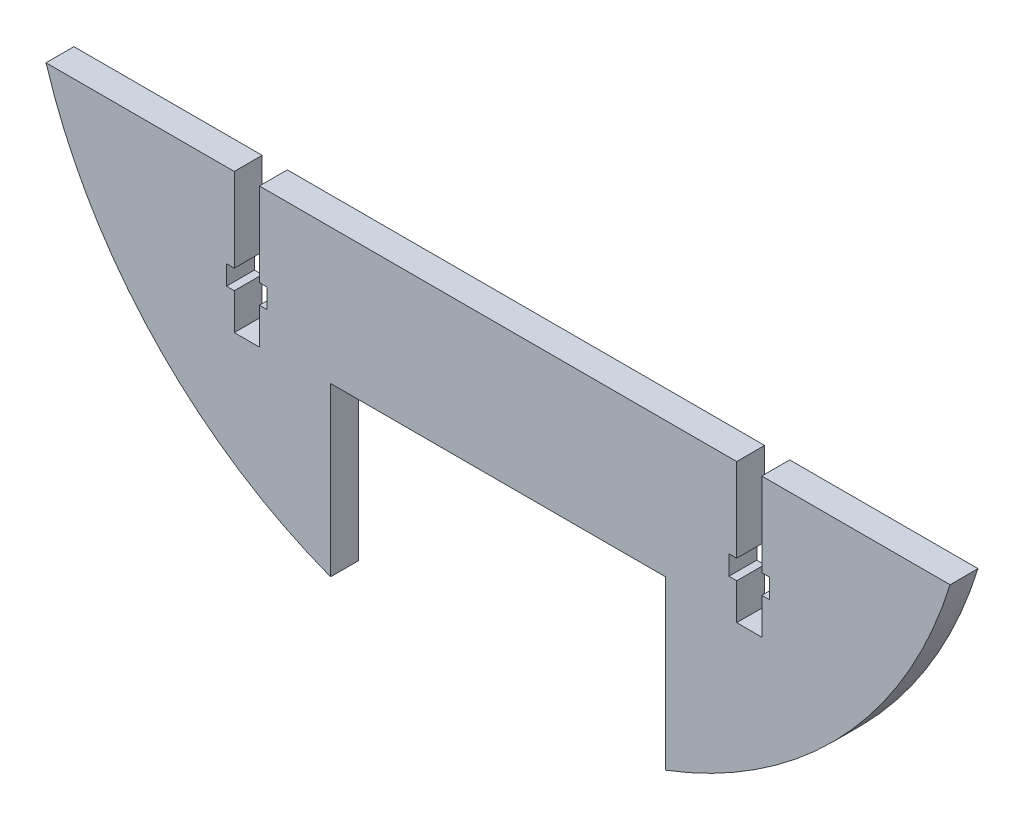
ISO-10303-21;
HEADER;
FILE_DESCRIPTION(('STEP AP214'),'2;1');
FILE_NAME('part.step','',(''),(''),'','','');
FILE_SCHEMA(('AUTOMOTIVE_DESIGN { 1 0 10303 214 1 1 1 1 }'));
ENDSEC;
DATA;
#1=APPLICATION_CONTEXT('core data for automotive mechanical design processes');
#2=APPLICATION_PROTOCOL_DEFINITION('international standard','automotive_design',2000,#1);
#3=PRODUCT_CONTEXT('',#1,'mechanical');
#4=PRODUCT('Part','Part','',(#3));
#5=PRODUCT_RELATED_PRODUCT_CATEGORY('part','',(#4));
#6=PRODUCT_DEFINITION_FORMATION('','',#4);
#7=PRODUCT_DEFINITION_CONTEXT('part definition',#1,'design');
#8=PRODUCT_DEFINITION('design','',#6,#7);
#9=PRODUCT_DEFINITION_SHAPE('','',#8);
#10=(LENGTH_UNIT() NAMED_UNIT(*) SI_UNIT(.MILLI.,.METRE.));
#11=(NAMED_UNIT(*) PLANE_ANGLE_UNIT() SI_UNIT($,.RADIAN.));
#12=(NAMED_UNIT(*) SI_UNIT($,.STERADIAN.) SOLID_ANGLE_UNIT());
#13=UNCERTAINTY_MEASURE_WITH_UNIT(LENGTH_MEASURE(1.E-05),#10,'distance_accuracy_value','');
#14=(GEOMETRIC_REPRESENTATION_CONTEXT(3) GLOBAL_UNCERTAINTY_ASSIGNED_CONTEXT((#13)) GLOBAL_UNIT_ASSIGNED_CONTEXT((#10,
#11,#12)) REPRESENTATION_CONTEXT('',''));
#15=CARTESIAN_POINT('',(0.,0.,0.));
#16=DIRECTION('',(0.,0.,1.));
#17=DIRECTION('',(1.,0.,0.));
#18=AXIS2_PLACEMENT_3D('',#15,#16,#17);
#19=CARTESIAN_POINT('',(0.,0.,5.));
#20=DIRECTION('',(0.,0.,-1.));
#21=DIRECTION('',(-1.,0.,0.));
#22=AXIS2_PLACEMENT_3D('',#19,#20,#21);
#23=CYLINDRICAL_SURFACE('',#22,84.75);
#24=CARTESIAN_POINT('',(0.,0.,0.));
#25=DIRECTION('',(0.,0.,1.));
#26=DIRECTION('',(1.,0.,0.));
#27=AXIS2_PLACEMENT_3D('',#24,#25,#26);
#28=CIRCLE('',#27,84.75);
#29=CARTESIAN_POINT('',(-80.9787780841376,-25.,0.));
#30=VERTEX_POINT('',#29);
#31=CARTESIAN_POINT('',(-30.,-79.2626172921384,0.));
#32=VERTEX_POINT('',#31);
#33=EDGE_CURVE('E262',#30,#32,#28,.T.);
#34=ORIENTED_EDGE('',*,*,#33,.T.);
#35=DIRECTION('',(0.,0.,-1.));
#36=VECTOR('',#35,1.);
#37=CARTESIAN_POINT('',(-30.,-79.2626172921384,5.));
#38=LINE('',#37,#36);
#39=CARTESIAN_POINT('',(-30.,-79.2626172921384,5.));
#40=VERTEX_POINT('',#39);
#41=EDGE_CURVE('E11',#40,#32,#38,.T.);
#42=ORIENTED_EDGE('',*,*,#41,.F.);
#43=CARTESIAN_POINT('',(0.,0.,5.));
#44=DIRECTION('',(0.,0.,1.));
#45=DIRECTION('',(1.,0.,0.));
#46=AXIS2_PLACEMENT_3D('',#43,#44,#45);
#47=CIRCLE('',#46,84.75);
#48=CARTESIAN_POINT('',(-80.9787780841376,-25.,5.));
#49=VERTEX_POINT('',#48);
#50=EDGE_CURVE('E320',#49,#40,#47,.T.);
#51=ORIENTED_EDGE('',*,*,#50,.F.);
#52=DIRECTION('',(0.,0.,-1.));
#53=VECTOR('',#52,1.);
#54=CARTESIAN_POINT('',(-80.9787780841376,-25.,5.));
#55=LINE('',#54,#53);
#56=EDGE_CURVE('E258',#49,#30,#55,.T.);
#57=ORIENTED_EDGE('',*,*,#56,.T.);
#58=EDGE_LOOP('',(#34,#42,#51,#57));
#59=FACE_BOUND('',#58,.T.);
#60=ADVANCED_FACE('F34',(#59),#23,.T.);
#61=CARTESIAN_POINT('',(-30.,-79.2626172921384,5.));
#62=DIRECTION('',(-1.,0.,0.));
#63=DIRECTION('',(0.,0.,1.));
#64=AXIS2_PLACEMENT_3D('',#61,#62,#63);
#65=PLANE('',#64);
#66=DIRECTION('',(0.,1.,0.));
#67=VECTOR('',#66,1.);
#68=CARTESIAN_POINT('',(-30.,-79.2626172921384,0.));
#69=LINE('',#68,#67);
#70=CARTESIAN_POINT('',(-30.,-49.2626172921384,0.));
#71=VERTEX_POINT('',#70);
#72=EDGE_CURVE('E265',#32,#71,#69,.T.);
#73=ORIENTED_EDGE('',*,*,#72,.T.);
#74=DIRECTION('',(0.,0.,-1.));
#75=VECTOR('',#74,1.);
#76=CARTESIAN_POINT('',(-30.,-49.2626172921384,5.));
#77=LINE('',#76,#75);
#78=CARTESIAN_POINT('',(-30.,-49.2626172921384,5.));
#79=VERTEX_POINT('',#78);
#80=EDGE_CURVE('E42',#79,#71,#77,.T.);
#81=ORIENTED_EDGE('',*,*,#80,.F.);
#82=DIRECTION('',(0.,1.,0.));
#83=VECTOR('',#82,1.);
#84=CARTESIAN_POINT('',(-30.,-79.2626172921384,5.));
#85=LINE('',#84,#83);
#86=EDGE_CURVE('E159',#40,#79,#85,.T.);
#87=ORIENTED_EDGE('',*,*,#86,.F.);
#88=ORIENTED_EDGE('',*,*,#41,.T.);
#89=EDGE_LOOP('',(#73,#81,#87,#88));
#90=FACE_BOUND('',#89,.T.);
#91=ADVANCED_FACE('F488',(#90),#65,.F.);
#92=CARTESIAN_POINT('',(-30.,-49.2626172921384,5.));
#93=DIRECTION('',(0.,1.,0.));
#94=DIRECTION('',(0.,0.,1.));
#95=AXIS2_PLACEMENT_3D('',#92,#93,#94);
#96=PLANE('',#95);
#97=DIRECTION('',(1.,0.,0.));
#98=VECTOR('',#97,1.);
#99=CARTESIAN_POINT('',(-30.,-49.2626172921384,0.));
#100=LINE('',#99,#98);
#101=CARTESIAN_POINT('',(30.,-49.2626172921384,0.));
#102=VERTEX_POINT('',#101);
#103=EDGE_CURVE('E267',#71,#102,#100,.T.);
#104=ORIENTED_EDGE('',*,*,#103,.T.);
#105=DIRECTION('',(0.,0.,-1.));
#106=VECTOR('',#105,1.);
#107=CARTESIAN_POINT('',(30.,-49.2626172921384,5.));
#108=LINE('',#107,#106);
#109=CARTESIAN_POINT('',(30.,-49.2626172921384,5.));
#110=VERTEX_POINT('',#109);
#111=EDGE_CURVE('E393',#110,#102,#108,.T.);
#112=ORIENTED_EDGE('',*,*,#111,.F.);
#113=DIRECTION('',(1.,0.,0.));
#114=VECTOR('',#113,1.);
#115=CARTESIAN_POINT('',(-30.,-49.2626172921384,5.));
#116=LINE('',#115,#114);
#117=EDGE_CURVE('E401',#79,#110,#116,.T.);
#118=ORIENTED_EDGE('',*,*,#117,.F.);
#119=ORIENTED_EDGE('',*,*,#80,.T.);
#120=EDGE_LOOP('',(#104,#112,#118,#119));
#121=FACE_BOUND('',#120,.T.);
#122=ADVANCED_FACE('F399',(#121),#96,.F.);
#123=CARTESIAN_POINT('',(30.,-79.2626172921384,5.));
#124=DIRECTION('',(1.,0.,0.));
#125=DIRECTION('',(0.,1.,0.));
#126=AXIS2_PLACEMENT_3D('',#123,#124,#125);
#127=PLANE('',#126);
#128=DIRECTION('',(0.,-1.,0.));
#129=VECTOR('',#128,1.);
#130=CARTESIAN_POINT('',(30.,-79.2626172921384,0.));
#131=LINE('',#130,#129);
#132=CARTESIAN_POINT('',(30.,-79.2626172921384,0.));
#133=VERTEX_POINT('',#132);
#134=EDGE_CURVE('E269',#102,#133,#131,.T.);
#135=ORIENTED_EDGE('',*,*,#134,.T.);
#136=DIRECTION('',(0.,0.,-1.));
#137=VECTOR('',#136,1.);
#138=CARTESIAN_POINT('',(30.,-79.2626172921384,5.));
#139=LINE('',#138,#137);
#140=CARTESIAN_POINT('',(30.,-79.2626172921384,5.));
#141=VERTEX_POINT('',#140);
#142=EDGE_CURVE('E390',#141,#133,#139,.T.);
#143=ORIENTED_EDGE('',*,*,#142,.F.);
#144=DIRECTION('',(0.,-1.,0.));
#145=VECTOR('',#144,1.);
#146=CARTESIAN_POINT('',(30.,-79.2626172921384,5.));
#147=LINE('',#146,#145);
#148=EDGE_CURVE('E419',#110,#141,#147,.T.);
#149=ORIENTED_EDGE('',*,*,#148,.F.);
#150=ORIENTED_EDGE('',*,*,#111,.T.);
#151=EDGE_LOOP('',(#135,#143,#149,#150));
#152=FACE_BOUND('',#151,.T.);
#153=ADVANCED_FACE('F410',(#152),#127,.F.);
#154=CARTESIAN_POINT('',(0.,0.,5.));
#155=DIRECTION('',(0.,0.,-1.));
#156=DIRECTION('',(-1.,0.,0.));
#157=AXIS2_PLACEMENT_3D('',#154,#155,#156);
#158=CYLINDRICAL_SURFACE('',#157,84.75);
#159=CARTESIAN_POINT('',(0.,0.,0.));
#160=DIRECTION('',(0.,0.,1.));
#161=DIRECTION('',(1.,0.,0.));
#162=AXIS2_PLACEMENT_3D('',#159,#160,#161);
#163=CIRCLE('',#162,84.75);
#164=CARTESIAN_POINT('',(80.9787780841376,-25.,0.));
#165=VERTEX_POINT('',#164);
#166=EDGE_CURVE('E271',#133,#165,#163,.T.);
#167=ORIENTED_EDGE('',*,*,#166,.T.);
#168=DIRECTION('',(0.,0.,-1.));
#169=VECTOR('',#168,1.);
#170=CARTESIAN_POINT('',(80.9787780841376,-25.,5.));
#171=LINE('',#170,#169);
#172=CARTESIAN_POINT('',(80.9787780841376,-25.,5.));
#173=VERTEX_POINT('',#172);
#174=EDGE_CURVE('E387',#173,#165,#171,.T.);
#175=ORIENTED_EDGE('',*,*,#174,.F.);
#176=CARTESIAN_POINT('',(0.,0.,5.));
#177=DIRECTION('',(0.,0.,1.));
#178=DIRECTION('',(1.,0.,0.));
#179=AXIS2_PLACEMENT_3D('',#176,#177,#178);
#180=CIRCLE('',#179,84.75);
#181=EDGE_CURVE('E416',#141,#173,#180,.T.);
#182=ORIENTED_EDGE('',*,*,#181,.F.);
#183=ORIENTED_EDGE('',*,*,#142,.T.);
#184=EDGE_LOOP('',(#167,#175,#182,#183));
#185=FACE_BOUND('',#184,.T.);
#186=ADVANCED_FACE('F414',(#185),#158,.T.);
#187=CARTESIAN_POINT('',(47.25,-25.,5.));
#188=DIRECTION('',(0.,-1.,0.));
#189=DIRECTION('',(1.,0.,0.));
#190=AXIS2_PLACEMENT_3D('',#187,#188,#189);
#191=PLANE('',#190);
#192=DIRECTION('',(-1.,0.,0.));
#193=VECTOR('',#192,1.);
#194=CARTESIAN_POINT('',(47.25,-25.,0.));
#195=LINE('',#194,#193);
#196=CARTESIAN_POINT('',(47.25,-25.,0.));
#197=VERTEX_POINT('',#196);
#198=EDGE_CURVE('E273',#165,#197,#195,.T.);
#199=ORIENTED_EDGE('',*,*,#198,.T.);
#200=DIRECTION('',(0.,0.,-1.));
#201=VECTOR('',#200,1.);
#202=CARTESIAN_POINT('',(47.25,-25.,5.));
#203=LINE('',#202,#201);
#204=CARTESIAN_POINT('',(47.25,-25.,5.));
#205=VERTEX_POINT('',#204);
#206=EDGE_CURVE('E384',#205,#197,#203,.T.);
#207=ORIENTED_EDGE('',*,*,#206,.F.);
#208=DIRECTION('',(-1.,0.,0.));
#209=VECTOR('',#208,1.);
#210=CARTESIAN_POINT('',(47.25,-25.,5.));
#211=LINE('',#210,#209);
#212=EDGE_CURVE('E418',#173,#205,#211,.T.);
#213=ORIENTED_EDGE('',*,*,#212,.F.);
#214=ORIENTED_EDGE('',*,*,#174,.T.);
#215=EDGE_LOOP('',(#199,#207,#213,#214));
#216=FACE_BOUND('',#215,.T.);
#217=ADVANCED_FACE('F501',(#216),#191,.F.);
#218=CARTESIAN_POINT('',(47.25,-25.,5.));
#219=DIRECTION('',(1.,0.,0.));
#220=DIRECTION('',(0.,1.,0.));
#221=AXIS2_PLACEMENT_3D('',#218,#219,#220);
#222=PLANE('',#221);
#223=DIRECTION('',(0.,-1.,0.));
#224=VECTOR('',#223,1.);
#225=CARTESIAN_POINT('',(47.25,-25.,0.));
#226=LINE('',#225,#224);
#227=CARTESIAN_POINT('',(47.25,-39.9999999999999,0.));
#228=VERTEX_POINT('',#227);
#229=EDGE_CURVE('E275',#197,#228,#226,.T.);
#230=ORIENTED_EDGE('',*,*,#229,.T.);
#231=DIRECTION('',(0.,0.,-1.));
#232=VECTOR('',#231,1.);
#233=CARTESIAN_POINT('',(47.25,-39.9999999999999,5.));
#234=LINE('',#233,#232);
#235=CARTESIAN_POINT('',(47.25,-39.9999999999999,5.));
#236=VERTEX_POINT('',#235);
#237=EDGE_CURVE('E381',#236,#228,#234,.T.);
#238=ORIENTED_EDGE('',*,*,#237,.F.);
#239=DIRECTION('',(0.,-1.,0.));
#240=VECTOR('',#239,1.);
#241=CARTESIAN_POINT('',(47.25,-25.,5.));
#242=LINE('',#241,#240);
#243=EDGE_CURVE('E421',#205,#236,#242,.T.);
#244=ORIENTED_EDGE('',*,*,#243,.F.);
#245=ORIENTED_EDGE('',*,*,#206,.T.);
#246=EDGE_LOOP('',(#230,#238,#244,#245));
#247=FACE_BOUND('',#246,.T.);
#248=ADVANCED_FACE('F504',(#247),#222,.F.);
#249=CARTESIAN_POINT('',(47.25,-39.9999999999999,5.));
#250=DIRECTION('',(0.,1.,0.));
#251=DIRECTION('',(0.,0.,1.));
#252=AXIS2_PLACEMENT_3D('',#249,#250,#251);
#253=PLANE('',#252);
#254=DIRECTION('',(1.,0.,0.));
#255=VECTOR('',#254,1.);
#256=CARTESIAN_POINT('',(47.25,-39.9999999999999,0.));
#257=LINE('',#256,#255);
#258=CARTESIAN_POINT('',(48.65,-39.9999999999999,0.));
#259=VERTEX_POINT('',#258);
#260=EDGE_CURVE('E277',#228,#259,#257,.T.);
#261=ORIENTED_EDGE('',*,*,#260,.T.);
#262=DIRECTION('',(0.,0.,-1.));
#263=VECTOR('',#262,1.);
#264=CARTESIAN_POINT('',(48.65,-39.9999999999999,5.));
#265=LINE('',#264,#263);
#266=CARTESIAN_POINT('',(48.65,-39.9999999999999,5.));
#267=VERTEX_POINT('',#266);
#268=EDGE_CURVE('E378',#267,#259,#265,.T.);
#269=ORIENTED_EDGE('',*,*,#268,.F.);
#270=DIRECTION('',(1.,0.,0.));
#271=VECTOR('',#270,1.);
#272=CARTESIAN_POINT('',(47.25,-39.9999999999999,5.));
#273=LINE('',#272,#271);
#274=EDGE_CURVE('E427',#236,#267,#273,.T.);
#275=ORIENTED_EDGE('',*,*,#274,.F.);
#276=ORIENTED_EDGE('',*,*,#237,.T.);
#277=EDGE_LOOP('',(#261,#269,#275,#276));
#278=FACE_BOUND('',#277,.T.);
#279=ADVANCED_FACE('F508',(#278),#253,.F.);
#280=CARTESIAN_POINT('',(48.65,-39.9999999999999,5.));
#281=DIRECTION('',(1.,0.,0.));
#282=DIRECTION('',(0.,1.,0.));
#283=AXIS2_PLACEMENT_3D('',#280,#281,#282);
#284=PLANE('',#283);
#285=DIRECTION('',(0.,-1.,0.));
#286=VECTOR('',#285,1.);
#287=CARTESIAN_POINT('',(48.65,-39.9999999999999,0.));
#288=LINE('',#287,#286);
#289=CARTESIAN_POINT('',(48.65,-43.4999999999999,0.));
#290=VERTEX_POINT('',#289);
#291=EDGE_CURVE('E279',#259,#290,#288,.T.);
#292=ORIENTED_EDGE('',*,*,#291,.T.);
#293=DIRECTION('',(0.,0.,-1.));
#294=VECTOR('',#293,1.);
#295=CARTESIAN_POINT('',(48.65,-43.4999999999999,5.));
#296=LINE('',#295,#294);
#297=CARTESIAN_POINT('',(48.65,-43.4999999999999,5.));
#298=VERTEX_POINT('',#297);
#299=EDGE_CURVE('E375',#298,#290,#296,.T.);
#300=ORIENTED_EDGE('',*,*,#299,.F.);
#301=DIRECTION('',(0.,-1.,0.));
#302=VECTOR('',#301,1.);
#303=CARTESIAN_POINT('',(48.65,-39.9999999999999,5.));
#304=LINE('',#303,#302);
#305=EDGE_CURVE('E429',#267,#298,#304,.T.);
#306=ORIENTED_EDGE('',*,*,#305,.F.);
#307=ORIENTED_EDGE('',*,*,#268,.T.);
#308=EDGE_LOOP('',(#292,#300,#306,#307));
#309=FACE_BOUND('',#308,.T.);
#310=ADVANCED_FACE('F512',(#309),#284,.F.);
#311=CARTESIAN_POINT('',(48.65,-43.4999999999999,5.));
#312=DIRECTION('',(0.,-1.,0.));
#313=DIRECTION('',(0.,0.,-1.));
#314=AXIS2_PLACEMENT_3D('',#311,#312,#313);
#315=PLANE('',#314);
#316=DIRECTION('',(-1.,0.,0.));
#317=VECTOR('',#316,1.);
#318=CARTESIAN_POINT('',(48.65,-43.4999999999999,0.));
#319=LINE('',#318,#317);
#320=CARTESIAN_POINT('',(47.25,-43.4999999999999,0.));
#321=VERTEX_POINT('',#320);
#322=EDGE_CURVE('E281',#290,#321,#319,.T.);
#323=ORIENTED_EDGE('',*,*,#322,.T.);
#324=DIRECTION('',(0.,0.,-1.));
#325=VECTOR('',#324,1.);
#326=CARTESIAN_POINT('',(47.25,-43.4999999999999,5.));
#327=LINE('',#326,#325);
#328=CARTESIAN_POINT('',(47.25,-43.4999999999999,5.));
#329=VERTEX_POINT('',#328);
#330=EDGE_CURVE('E372',#329,#321,#327,.T.);
#331=ORIENTED_EDGE('',*,*,#330,.F.);
#332=DIRECTION('',(-1.,0.,0.));
#333=VECTOR('',#332,1.);
#334=CARTESIAN_POINT('',(48.65,-43.4999999999999,5.));
#335=LINE('',#334,#333);
#336=EDGE_CURVE('E431',#298,#329,#335,.T.);
#337=ORIENTED_EDGE('',*,*,#336,.F.);
#338=ORIENTED_EDGE('',*,*,#299,.T.);
#339=EDGE_LOOP('',(#323,#331,#337,#338));
#340=FACE_BOUND('',#339,.T.);
#341=ADVANCED_FACE('F516',(#340),#315,.F.);
#342=CARTESIAN_POINT('',(47.25,-43.4999999999999,5.));
#343=DIRECTION('',(1.,0.,0.));
#344=DIRECTION('',(0.,1.,0.));
#345=AXIS2_PLACEMENT_3D('',#342,#343,#344);
#346=PLANE('',#345);
#347=DIRECTION('',(0.,-1.,0.));
#348=VECTOR('',#347,1.);
#349=CARTESIAN_POINT('',(47.25,-43.4999999999999,0.));
#350=LINE('',#349,#348);
#351=CARTESIAN_POINT('',(47.25,-49.9999999999999,0.));
#352=VERTEX_POINT('',#351);
#353=EDGE_CURVE('E283',#321,#352,#350,.T.);
#354=ORIENTED_EDGE('',*,*,#353,.T.);
#355=DIRECTION('',(0.,0.,-1.));
#356=VECTOR('',#355,1.);
#357=CARTESIAN_POINT('',(47.25,-49.9999999999999,5.));
#358=LINE('',#357,#356);
#359=CARTESIAN_POINT('',(47.25,-49.9999999999999,5.));
#360=VERTEX_POINT('',#359);
#361=EDGE_CURVE('E369',#360,#352,#358,.T.);
#362=ORIENTED_EDGE('',*,*,#361,.F.);
#363=DIRECTION('',(0.,-1.,0.));
#364=VECTOR('',#363,1.);
#365=CARTESIAN_POINT('',(47.25,-43.4999999999999,5.));
#366=LINE('',#365,#364);
#367=EDGE_CURVE('E433',#329,#360,#366,.T.);
#368=ORIENTED_EDGE('',*,*,#367,.F.);
#369=ORIENTED_EDGE('',*,*,#330,.T.);
#370=EDGE_LOOP('',(#354,#362,#368,#369));
#371=FACE_BOUND('',#370,.T.);
#372=ADVANCED_FACE('F520',(#371),#346,.F.);
#373=CARTESIAN_POINT('',(42.75,-49.9999999999999,5.));
#374=DIRECTION('',(0.,-1.,0.));
#375=DIRECTION('',(0.,0.,-1.));
#376=AXIS2_PLACEMENT_3D('',#373,#374,#375);
#377=PLANE('',#376);
#378=DIRECTION('',(-1.,0.,0.));
#379=VECTOR('',#378,1.);
#380=CARTESIAN_POINT('',(42.75,-49.9999999999999,0.));
#381=LINE('',#380,#379);
#382=CARTESIAN_POINT('',(42.75,-49.9999999999999,0.));
#383=VERTEX_POINT('',#382);
#384=EDGE_CURVE('E285',#352,#383,#381,.T.);
#385=ORIENTED_EDGE('',*,*,#384,.T.);
#386=DIRECTION('',(0.,0.,-1.));
#387=VECTOR('',#386,1.);
#388=CARTESIAN_POINT('',(42.75,-49.9999999999999,5.));
#389=LINE('',#388,#387);
#390=CARTESIAN_POINT('',(42.75,-49.9999999999999,5.));
#391=VERTEX_POINT('',#390);
#392=EDGE_CURVE('E366',#391,#383,#389,.T.);
#393=ORIENTED_EDGE('',*,*,#392,.F.);
#394=DIRECTION('',(-1.,0.,0.));
#395=VECTOR('',#394,1.);
#396=CARTESIAN_POINT('',(42.75,-49.9999999999999,5.));
#397=LINE('',#396,#395);
#398=EDGE_CURVE('E435',#360,#391,#397,.T.);
#399=ORIENTED_EDGE('',*,*,#398,.F.);
#400=ORIENTED_EDGE('',*,*,#361,.T.);
#401=EDGE_LOOP('',(#385,#393,#399,#400));
#402=FACE_BOUND('',#401,.T.);
#403=ADVANCED_FACE('F524',(#402),#377,.F.);
#404=CARTESIAN_POINT('',(42.75,-43.4999999999999,5.));
#405=DIRECTION('',(-1.,0.,0.));
#406=DIRECTION('',(0.,-1.,0.));
#407=AXIS2_PLACEMENT_3D('',#404,#405,#406);
#408=PLANE('',#407);
#409=DIRECTION('',(0.,1.,0.));
#410=VECTOR('',#409,1.);
#411=CARTESIAN_POINT('',(42.75,-43.4999999999999,0.));
#412=LINE('',#411,#410);
#413=CARTESIAN_POINT('',(42.75,-43.4999999999999,0.));
#414=VERTEX_POINT('',#413);
#415=EDGE_CURVE('E287',#383,#414,#412,.T.);
#416=ORIENTED_EDGE('',*,*,#415,.T.);
#417=DIRECTION('',(0.,0.,-1.));
#418=VECTOR('',#417,1.);
#419=CARTESIAN_POINT('',(42.75,-43.4999999999999,5.));
#420=LINE('',#419,#418);
#421=CARTESIAN_POINT('',(42.75,-43.4999999999999,5.));
#422=VERTEX_POINT('',#421);
#423=EDGE_CURVE('E363',#422,#414,#420,.T.);
#424=ORIENTED_EDGE('',*,*,#423,.F.);
#425=DIRECTION('',(0.,1.,0.));
#426=VECTOR('',#425,1.);
#427=CARTESIAN_POINT('',(42.75,-43.4999999999999,5.));
#428=LINE('',#427,#426);
#429=EDGE_CURVE('E437',#391,#422,#428,.T.);
#430=ORIENTED_EDGE('',*,*,#429,.F.);
#431=ORIENTED_EDGE('',*,*,#392,.T.);
#432=EDGE_LOOP('',(#416,#424,#430,#431));
#433=FACE_BOUND('',#432,.T.);
#434=ADVANCED_FACE('F528',(#433),#408,.F.);
#435=CARTESIAN_POINT('',(41.35,-43.4999999999999,5.));
#436=DIRECTION('',(0.,-1.,0.));
#437=DIRECTION('',(0.,0.,-1.));
#438=AXIS2_PLACEMENT_3D('',#435,#436,#437);
#439=PLANE('',#438);
#440=DIRECTION('',(-1.,0.,0.));
#441=VECTOR('',#440,1.);
#442=CARTESIAN_POINT('',(41.35,-43.4999999999999,0.));
#443=LINE('',#442,#441);
#444=CARTESIAN_POINT('',(41.35,-43.4999999999999,0.));
#445=VERTEX_POINT('',#444);
#446=EDGE_CURVE('E289',#414,#445,#443,.T.);
#447=ORIENTED_EDGE('',*,*,#446,.T.);
#448=DIRECTION('',(0.,0.,-1.));
#449=VECTOR('',#448,1.);
#450=CARTESIAN_POINT('',(41.35,-43.4999999999999,5.));
#451=LINE('',#450,#449);
#452=CARTESIAN_POINT('',(41.35,-43.4999999999999,5.));
#453=VERTEX_POINT('',#452);
#454=EDGE_CURVE('E360',#453,#445,#451,.T.);
#455=ORIENTED_EDGE('',*,*,#454,.F.);
#456=DIRECTION('',(-1.,0.,0.));
#457=VECTOR('',#456,1.);
#458=CARTESIAN_POINT('',(41.35,-43.4999999999999,5.));
#459=LINE('',#458,#457);
#460=EDGE_CURVE('E439',#422,#453,#459,.T.);
#461=ORIENTED_EDGE('',*,*,#460,.F.);
#462=ORIENTED_EDGE('',*,*,#423,.T.);
#463=EDGE_LOOP('',(#447,#455,#461,#462));
#464=FACE_BOUND('',#463,.T.);
#465=ADVANCED_FACE('F532',(#464),#439,.F.);
#466=CARTESIAN_POINT('',(41.35,-39.9999999999999,5.));
#467=DIRECTION('',(-1.,0.,0.));
#468=DIRECTION('',(0.,-1.,0.));
#469=AXIS2_PLACEMENT_3D('',#466,#467,#468);
#470=PLANE('',#469);
#471=DIRECTION('',(0.,1.,0.));
#472=VECTOR('',#471,1.);
#473=CARTESIAN_POINT('',(41.35,-39.9999999999999,0.));
#474=LINE('',#473,#472);
#475=CARTESIAN_POINT('',(41.35,-39.9999999999999,0.));
#476=VERTEX_POINT('',#475);
#477=EDGE_CURVE('E291',#445,#476,#474,.T.);
#478=ORIENTED_EDGE('',*,*,#477,.T.);
#479=DIRECTION('',(0.,0.,-1.));
#480=VECTOR('',#479,1.);
#481=CARTESIAN_POINT('',(41.35,-39.9999999999999,5.));
#482=LINE('',#481,#480);
#483=CARTESIAN_POINT('',(41.35,-39.9999999999999,5.));
#484=VERTEX_POINT('',#483);
#485=EDGE_CURVE('E357',#484,#476,#482,.T.);
#486=ORIENTED_EDGE('',*,*,#485,.F.);
#487=DIRECTION('',(0.,1.,0.));
#488=VECTOR('',#487,1.);
#489=CARTESIAN_POINT('',(41.35,-39.9999999999999,5.));
#490=LINE('',#489,#488);
#491=EDGE_CURVE('E441',#453,#484,#490,.T.);
#492=ORIENTED_EDGE('',*,*,#491,.F.);
#493=ORIENTED_EDGE('',*,*,#454,.T.);
#494=EDGE_LOOP('',(#478,#486,#492,#493));
#495=FACE_BOUND('',#494,.T.);
#496=ADVANCED_FACE('F536',(#495),#470,.F.);
#497=CARTESIAN_POINT('',(42.75,-39.9999999999999,5.));
#498=DIRECTION('',(0.,1.,0.));
#499=DIRECTION('',(0.,0.,1.));
#500=AXIS2_PLACEMENT_3D('',#497,#498,#499);
#501=PLANE('',#500);
#502=DIRECTION('',(1.,0.,0.));
#503=VECTOR('',#502,1.);
#504=CARTESIAN_POINT('',(42.75,-39.9999999999999,0.));
#505=LINE('',#504,#503);
#506=CARTESIAN_POINT('',(42.75,-39.9999999999999,0.));
#507=VERTEX_POINT('',#506);
#508=EDGE_CURVE('E293',#476,#507,#505,.T.);
#509=ORIENTED_EDGE('',*,*,#508,.T.);
#510=DIRECTION('',(0.,0.,-1.));
#511=VECTOR('',#510,1.);
#512=CARTESIAN_POINT('',(42.75,-39.9999999999999,5.));
#513=LINE('',#512,#511);
#514=CARTESIAN_POINT('',(42.75,-39.9999999999999,5.));
#515=VERTEX_POINT('',#514);
#516=EDGE_CURVE('E354',#515,#507,#513,.T.);
#517=ORIENTED_EDGE('',*,*,#516,.F.);
#518=DIRECTION('',(1.,0.,0.));
#519=VECTOR('',#518,1.);
#520=CARTESIAN_POINT('',(42.75,-39.9999999999999,5.));
#521=LINE('',#520,#519);
#522=EDGE_CURVE('E443',#484,#515,#521,.T.);
#523=ORIENTED_EDGE('',*,*,#522,.F.);
#524=ORIENTED_EDGE('',*,*,#485,.T.);
#525=EDGE_LOOP('',(#509,#517,#523,#524));
#526=FACE_BOUND('',#525,.T.);
#527=ADVANCED_FACE('F540',(#526),#501,.F.);
#528=CARTESIAN_POINT('',(42.75,-25.,5.));
#529=DIRECTION('',(-1.,0.,0.));
#530=DIRECTION('',(0.,-1.,0.));
#531=AXIS2_PLACEMENT_3D('',#528,#529,#530);
#532=PLANE('',#531);
#533=DIRECTION('',(0.,1.,0.));
#534=VECTOR('',#533,1.);
#535=CARTESIAN_POINT('',(42.75,-25.,0.));
#536=LINE('',#535,#534);
#537=CARTESIAN_POINT('',(42.75,-25.,0.));
#538=VERTEX_POINT('',#537);
#539=EDGE_CURVE('E295',#507,#538,#536,.T.);
#540=ORIENTED_EDGE('',*,*,#539,.T.);
#541=DIRECTION('',(0.,0.,-1.));
#542=VECTOR('',#541,1.);
#543=CARTESIAN_POINT('',(42.75,-25.,5.));
#544=LINE('',#543,#542);
#545=CARTESIAN_POINT('',(42.75,-25.,5.));
#546=VERTEX_POINT('',#545);
#547=EDGE_CURVE('E351',#546,#538,#544,.T.);
#548=ORIENTED_EDGE('',*,*,#547,.F.);
#549=DIRECTION('',(0.,1.,0.));
#550=VECTOR('',#549,1.);
#551=CARTESIAN_POINT('',(42.75,-25.,5.));
#552=LINE('',#551,#550);
#553=EDGE_CURVE('E445',#515,#546,#552,.T.);
#554=ORIENTED_EDGE('',*,*,#553,.F.);
#555=ORIENTED_EDGE('',*,*,#516,.T.);
#556=EDGE_LOOP('',(#540,#548,#554,#555));
#557=FACE_BOUND('',#556,.T.);
#558=ADVANCED_FACE('F544',(#557),#532,.F.);
#559=CARTESIAN_POINT('',(-42.75,-25.,5.));
#560=DIRECTION('',(0.,-1.,0.));
#561=DIRECTION('',(1.,0.,0.));
#562=AXIS2_PLACEMENT_3D('',#559,#560,#561);
#563=PLANE('',#562);
#564=DIRECTION('',(-1.,0.,0.));
#565=VECTOR('',#564,1.);
#566=CARTESIAN_POINT('',(-42.75,-25.,0.));
#567=LINE('',#566,#565);
#568=CARTESIAN_POINT('',(-42.75,-25.,0.));
#569=VERTEX_POINT('',#568);
#570=EDGE_CURVE('E297',#538,#569,#567,.T.);
#571=ORIENTED_EDGE('',*,*,#570,.T.);
#572=DIRECTION('',(0.,0.,-1.));
#573=VECTOR('',#572,1.);
#574=CARTESIAN_POINT('',(-42.75,-25.,5.));
#575=LINE('',#574,#573);
#576=CARTESIAN_POINT('',(-42.75,-25.,5.));
#577=VERTEX_POINT('',#576);
#578=EDGE_CURVE('E348',#577,#569,#575,.T.);
#579=ORIENTED_EDGE('',*,*,#578,.F.);
#580=DIRECTION('',(-1.,0.,0.));
#581=VECTOR('',#580,1.);
#582=CARTESIAN_POINT('',(-42.75,-25.,5.));
#583=LINE('',#582,#581);
#584=EDGE_CURVE('E447',#546,#577,#583,.T.);
#585=ORIENTED_EDGE('',*,*,#584,.F.);
#586=ORIENTED_EDGE('',*,*,#547,.T.);
#587=EDGE_LOOP('',(#571,#579,#585,#586));
#588=FACE_BOUND('',#587,.T.);
#589=ADVANCED_FACE('F548',(#588),#563,.F.);
#590=CARTESIAN_POINT('',(-42.75,-25.,5.));
#591=DIRECTION('',(1.,0.,0.));
#592=DIRECTION('',(0.,0.,-1.));
#593=AXIS2_PLACEMENT_3D('',#590,#591,#592);
#594=PLANE('',#593);
#595=DIRECTION('',(0.,-1.,0.));
#596=VECTOR('',#595,1.);
#597=CARTESIAN_POINT('',(-42.75,-25.,0.));
#598=LINE('',#597,#596);
#599=CARTESIAN_POINT('',(-42.75,-40.,0.));
#600=VERTEX_POINT('',#599);
#601=EDGE_CURVE('E299',#569,#600,#598,.T.);
#602=ORIENTED_EDGE('',*,*,#601,.T.);
#603=DIRECTION('',(0.,0.,-1.));
#604=VECTOR('',#603,1.);
#605=CARTESIAN_POINT('',(-42.75,-40.,5.));
#606=LINE('',#605,#604);
#607=CARTESIAN_POINT('',(-42.75,-40.,5.));
#608=VERTEX_POINT('',#607);
#609=EDGE_CURVE('E345',#608,#600,#606,.T.);
#610=ORIENTED_EDGE('',*,*,#609,.F.);
#611=DIRECTION('',(0.,-1.,0.));
#612=VECTOR('',#611,1.);
#613=CARTESIAN_POINT('',(-42.75,-25.,5.));
#614=LINE('',#613,#612);
#615=EDGE_CURVE('E449',#577,#608,#614,.T.);
#616=ORIENTED_EDGE('',*,*,#615,.F.);
#617=ORIENTED_EDGE('',*,*,#578,.T.);
#618=EDGE_LOOP('',(#602,#610,#616,#617));
#619=FACE_BOUND('',#618,.T.);
#620=ADVANCED_FACE('F552',(#619),#594,.F.);
#621=CARTESIAN_POINT('',(-42.75,-40.,5.));
#622=DIRECTION('',(0.,1.,0.));
#623=DIRECTION('',(0.,0.,1.));
#624=AXIS2_PLACEMENT_3D('',#621,#622,#623);
#625=PLANE('',#624);
#626=DIRECTION('',(1.,0.,0.));
#627=VECTOR('',#626,1.);
#628=CARTESIAN_POINT('',(-42.75,-40.,0.));
#629=LINE('',#628,#627);
#630=CARTESIAN_POINT('',(-41.35,-40.,0.));
#631=VERTEX_POINT('',#630);
#632=EDGE_CURVE('E301',#600,#631,#629,.T.);
#633=ORIENTED_EDGE('',*,*,#632,.T.);
#634=DIRECTION('',(0.,0.,-1.));
#635=VECTOR('',#634,1.);
#636=CARTESIAN_POINT('',(-41.35,-40.,5.));
#637=LINE('',#636,#635);
#638=CARTESIAN_POINT('',(-41.35,-40.,5.));
#639=VERTEX_POINT('',#638);
#640=EDGE_CURVE('E342',#639,#631,#637,.T.);
#641=ORIENTED_EDGE('',*,*,#640,.F.);
#642=DIRECTION('',(1.,0.,0.));
#643=VECTOR('',#642,1.);
#644=CARTESIAN_POINT('',(-42.75,-40.,5.));
#645=LINE('',#644,#643);
#646=EDGE_CURVE('E451',#608,#639,#645,.T.);
#647=ORIENTED_EDGE('',*,*,#646,.F.);
#648=ORIENTED_EDGE('',*,*,#609,.T.);
#649=EDGE_LOOP('',(#633,#641,#647,#648));
#650=FACE_BOUND('',#649,.T.);
#651=ADVANCED_FACE('F556',(#650),#625,.F.);
#652=CARTESIAN_POINT('',(-41.35,-40.,5.));
#653=DIRECTION('',(1.,0.,0.));
#654=DIRECTION('',(0.,1.,0.));
#655=AXIS2_PLACEMENT_3D('',#652,#653,#654);
#656=PLANE('',#655);
#657=DIRECTION('',(0.,-1.,0.));
#658=VECTOR('',#657,1.);
#659=CARTESIAN_POINT('',(-41.35,-40.,0.));
#660=LINE('',#659,#658);
#661=CARTESIAN_POINT('',(-41.35,-43.5,0.));
#662=VERTEX_POINT('',#661);
#663=EDGE_CURVE('E303',#631,#662,#660,.T.);
#664=ORIENTED_EDGE('',*,*,#663,.T.);
#665=DIRECTION('',(0.,0.,-1.));
#666=VECTOR('',#665,1.);
#667=CARTESIAN_POINT('',(-41.35,-43.5,5.));
#668=LINE('',#667,#666);
#669=CARTESIAN_POINT('',(-41.35,-43.5,5.));
#670=VERTEX_POINT('',#669);
#671=EDGE_CURVE('E339',#670,#662,#668,.T.);
#672=ORIENTED_EDGE('',*,*,#671,.F.);
#673=DIRECTION('',(0.,-1.,0.));
#674=VECTOR('',#673,1.);
#675=CARTESIAN_POINT('',(-41.35,-40.,5.));
#676=LINE('',#675,#674);
#677=EDGE_CURVE('E453',#639,#670,#676,.T.);
#678=ORIENTED_EDGE('',*,*,#677,.F.);
#679=ORIENTED_EDGE('',*,*,#640,.T.);
#680=EDGE_LOOP('',(#664,#672,#678,#679));
#681=FACE_BOUND('',#680,.T.);
#682=ADVANCED_FACE('F560',(#681),#656,.F.);
#683=CARTESIAN_POINT('',(-41.35,-43.5,5.));
#684=DIRECTION('',(0.,-1.,0.));
#685=DIRECTION('',(0.,0.,-1.));
#686=AXIS2_PLACEMENT_3D('',#683,#684,#685);
#687=PLANE('',#686);
#688=DIRECTION('',(-1.,0.,0.));
#689=VECTOR('',#688,1.);
#690=CARTESIAN_POINT('',(-41.35,-43.5,0.));
#691=LINE('',#690,#689);
#692=CARTESIAN_POINT('',(-42.75,-43.5,0.));
#693=VERTEX_POINT('',#692);
#694=EDGE_CURVE('E305',#662,#693,#691,.T.);
#695=ORIENTED_EDGE('',*,*,#694,.T.);
#696=DIRECTION('',(0.,0.,-1.));
#697=VECTOR('',#696,1.);
#698=CARTESIAN_POINT('',(-42.75,-43.5,5.));
#699=LINE('',#698,#697);
#700=CARTESIAN_POINT('',(-42.75,-43.5,5.));
#701=VERTEX_POINT('',#700);
#702=EDGE_CURVE('E336',#701,#693,#699,.T.);
#703=ORIENTED_EDGE('',*,*,#702,.F.);
#704=DIRECTION('',(-1.,0.,0.));
#705=VECTOR('',#704,1.);
#706=CARTESIAN_POINT('',(-41.35,-43.5,5.));
#707=LINE('',#706,#705);
#708=EDGE_CURVE('E455',#670,#701,#707,.T.);
#709=ORIENTED_EDGE('',*,*,#708,.F.);
#710=ORIENTED_EDGE('',*,*,#671,.T.);
#711=EDGE_LOOP('',(#695,#703,#709,#710));
#712=FACE_BOUND('',#711,.T.);
#713=ADVANCED_FACE('F564',(#712),#687,.F.);
#714=CARTESIAN_POINT('',(-42.75,-43.5,5.));
#715=DIRECTION('',(1.,0.,0.));
#716=DIRECTION('',(0.,1.,0.));
#717=AXIS2_PLACEMENT_3D('',#714,#715,#716);
#718=PLANE('',#717);
#719=DIRECTION('',(0.,-1.,0.));
#720=VECTOR('',#719,1.);
#721=CARTESIAN_POINT('',(-42.75,-43.5,0.));
#722=LINE('',#721,#720);
#723=CARTESIAN_POINT('',(-42.75,-50.,0.));
#724=VERTEX_POINT('',#723);
#725=EDGE_CURVE('E307',#693,#724,#722,.T.);
#726=ORIENTED_EDGE('',*,*,#725,.T.);
#727=DIRECTION('',(0.,0.,-1.));
#728=VECTOR('',#727,1.);
#729=CARTESIAN_POINT('',(-42.75,-50.,5.));
#730=LINE('',#729,#728);
#731=CARTESIAN_POINT('',(-42.75,-50.,5.));
#732=VERTEX_POINT('',#731);
#733=EDGE_CURVE('E333',#732,#724,#730,.T.);
#734=ORIENTED_EDGE('',*,*,#733,.F.);
#735=DIRECTION('',(0.,-1.,0.));
#736=VECTOR('',#735,1.);
#737=CARTESIAN_POINT('',(-42.75,-43.5,5.));
#738=LINE('',#737,#736);
#739=EDGE_CURVE('E457',#701,#732,#738,.T.);
#740=ORIENTED_EDGE('',*,*,#739,.F.);
#741=ORIENTED_EDGE('',*,*,#702,.T.);
#742=EDGE_LOOP('',(#726,#734,#740,#741));
#743=FACE_BOUND('',#742,.T.);
#744=ADVANCED_FACE('F568',(#743),#718,.F.);
#745=CARTESIAN_POINT('',(-47.25,-50.,5.));
#746=DIRECTION('',(0.,-1.,0.));
#747=DIRECTION('',(0.,0.,-1.));
#748=AXIS2_PLACEMENT_3D('',#745,#746,#747);
#749=PLANE('',#748);
#750=DIRECTION('',(-1.,0.,0.));
#751=VECTOR('',#750,1.);
#752=CARTESIAN_POINT('',(-47.25,-50.,0.));
#753=LINE('',#752,#751);
#754=CARTESIAN_POINT('',(-47.25,-50.,0.));
#755=VERTEX_POINT('',#754);
#756=EDGE_CURVE('E309',#724,#755,#753,.T.);
#757=ORIENTED_EDGE('',*,*,#756,.T.);
#758=DIRECTION('',(0.,0.,-1.));
#759=VECTOR('',#758,1.);
#760=CARTESIAN_POINT('',(-47.25,-50.,5.));
#761=LINE('',#760,#759);
#762=CARTESIAN_POINT('',(-47.25,-50.,5.));
#763=VERTEX_POINT('',#762);
#764=EDGE_CURVE('E330',#763,#755,#761,.T.);
#765=ORIENTED_EDGE('',*,*,#764,.F.);
#766=DIRECTION('',(-1.,0.,0.));
#767=VECTOR('',#766,1.);
#768=CARTESIAN_POINT('',(-47.25,-50.,5.));
#769=LINE('',#768,#767);
#770=EDGE_CURVE('E459',#732,#763,#769,.T.);
#771=ORIENTED_EDGE('',*,*,#770,.F.);
#772=ORIENTED_EDGE('',*,*,#733,.T.);
#773=EDGE_LOOP('',(#757,#765,#771,#772));
#774=FACE_BOUND('',#773,.T.);
#775=ADVANCED_FACE('F572',(#774),#749,.F.);
#776=CARTESIAN_POINT('',(-47.25,-43.5,5.));
#777=DIRECTION('',(-1.,0.,0.));
#778=DIRECTION('',(0.,-1.,0.));
#779=AXIS2_PLACEMENT_3D('',#776,#777,#778);
#780=PLANE('',#779);
#781=DIRECTION('',(0.,1.,0.));
#782=VECTOR('',#781,1.);
#783=CARTESIAN_POINT('',(-47.25,-43.5,0.));
#784=LINE('',#783,#782);
#785=CARTESIAN_POINT('',(-47.25,-43.5,0.));
#786=VERTEX_POINT('',#785);
#787=EDGE_CURVE('E311',#755,#786,#784,.T.);
#788=ORIENTED_EDGE('',*,*,#787,.T.);
#789=DIRECTION('',(0.,0.,-1.));
#790=VECTOR('',#789,1.);
#791=CARTESIAN_POINT('',(-47.25,-43.5,5.));
#792=LINE('',#791,#790);
#793=CARTESIAN_POINT('',(-47.25,-43.5,5.));
#794=VERTEX_POINT('',#793);
#795=EDGE_CURVE('E327',#794,#786,#792,.T.);
#796=ORIENTED_EDGE('',*,*,#795,.F.);
#797=DIRECTION('',(0.,1.,0.));
#798=VECTOR('',#797,1.);
#799=CARTESIAN_POINT('',(-47.25,-43.5,5.));
#800=LINE('',#799,#798);
#801=EDGE_CURVE('E461',#763,#794,#800,.T.);
#802=ORIENTED_EDGE('',*,*,#801,.F.);
#803=ORIENTED_EDGE('',*,*,#764,.T.);
#804=EDGE_LOOP('',(#788,#796,#802,#803));
#805=FACE_BOUND('',#804,.T.);
#806=ADVANCED_FACE('F576',(#805),#780,.F.);
#807=CARTESIAN_POINT('',(-48.65,-43.5,5.));
#808=DIRECTION('',(0.,-1.,0.));
#809=DIRECTION('',(0.,0.,-1.));
#810=AXIS2_PLACEMENT_3D('',#807,#808,#809);
#811=PLANE('',#810);
#812=DIRECTION('',(-1.,0.,0.));
#813=VECTOR('',#812,1.);
#814=CARTESIAN_POINT('',(-48.65,-43.5,0.));
#815=LINE('',#814,#813);
#816=CARTESIAN_POINT('',(-48.65,-43.5,0.));
#817=VERTEX_POINT('',#816);
#818=EDGE_CURVE('E313',#786,#817,#815,.T.);
#819=ORIENTED_EDGE('',*,*,#818,.T.);
#820=DIRECTION('',(0.,0.,-1.));
#821=VECTOR('',#820,1.);
#822=CARTESIAN_POINT('',(-48.65,-43.5,5.));
#823=LINE('',#822,#821);
#824=CARTESIAN_POINT('',(-48.65,-43.5,5.));
#825=VERTEX_POINT('',#824);
#826=EDGE_CURVE('E324',#825,#817,#823,.T.);
#827=ORIENTED_EDGE('',*,*,#826,.F.);
#828=DIRECTION('',(-1.,0.,0.));
#829=VECTOR('',#828,1.);
#830=CARTESIAN_POINT('',(-48.65,-43.5,5.));
#831=LINE('',#830,#829);
#832=EDGE_CURVE('E463',#794,#825,#831,.T.);
#833=ORIENTED_EDGE('',*,*,#832,.F.);
#834=ORIENTED_EDGE('',*,*,#795,.T.);
#835=EDGE_LOOP('',(#819,#827,#833,#834));
#836=FACE_BOUND('',#835,.T.);
#837=ADVANCED_FACE('F469',(#836),#811,.F.);
#838=CARTESIAN_POINT('',(-48.65,-40.,5.));
#839=DIRECTION('',(-1.,0.,0.));
#840=DIRECTION('',(0.,-1.,0.));
#841=AXIS2_PLACEMENT_3D('',#838,#839,#840);
#842=PLANE('',#841);
#843=DIRECTION('',(0.,1.,0.));
#844=VECTOR('',#843,1.);
#845=CARTESIAN_POINT('',(-48.65,-40.,0.));
#846=LINE('',#845,#844);
#847=CARTESIAN_POINT('',(-48.65,-40.,0.));
#848=VERTEX_POINT('',#847);
#849=EDGE_CURVE('E315',#817,#848,#846,.T.);
#850=ORIENTED_EDGE('',*,*,#849,.T.);
#851=DIRECTION('',(0.,0.,-1.));
#852=VECTOR('',#851,1.);
#853=CARTESIAN_POINT('',(-48.65,-40.,5.));
#854=LINE('',#853,#852);
#855=CARTESIAN_POINT('',(-48.65,-40.,5.));
#856=VERTEX_POINT('',#855);
#857=EDGE_CURVE('E253',#856,#848,#854,.T.);
#858=ORIENTED_EDGE('',*,*,#857,.F.);
#859=DIRECTION('',(0.,1.,0.));
#860=VECTOR('',#859,1.);
#861=CARTESIAN_POINT('',(-48.65,-40.,5.));
#862=LINE('',#861,#860);
#863=EDGE_CURVE('E244',#825,#856,#862,.T.);
#864=ORIENTED_EDGE('',*,*,#863,.F.);
#865=ORIENTED_EDGE('',*,*,#826,.T.);
#866=EDGE_LOOP('',(#850,#858,#864,#865));
#867=FACE_BOUND('',#866,.T.);
#868=ADVANCED_FACE('F473',(#867),#842,.F.);
#869=CARTESIAN_POINT('',(-47.25,-40.,5.));
#870=DIRECTION('',(0.,1.,0.));
#871=DIRECTION('',(0.,0.,1.));
#872=AXIS2_PLACEMENT_3D('',#869,#870,#871);
#873=PLANE('',#872);
#874=DIRECTION('',(1.,0.,0.));
#875=VECTOR('',#874,1.);
#876=CARTESIAN_POINT('',(-47.25,-40.,0.));
#877=LINE('',#876,#875);
#878=CARTESIAN_POINT('',(-47.25,-40.,0.));
#879=VERTEX_POINT('',#878);
#880=EDGE_CURVE('E252',#848,#879,#877,.T.);
#881=ORIENTED_EDGE('',*,*,#880,.T.);
#882=DIRECTION('',(0.,0.,-1.));
#883=VECTOR('',#882,1.);
#884=CARTESIAN_POINT('',(-47.25,-40.,5.));
#885=LINE('',#884,#883);
#886=CARTESIAN_POINT('',(-47.25,-40.,5.));
#887=VERTEX_POINT('',#886);
#888=EDGE_CURVE('E249',#887,#879,#885,.T.);
#889=ORIENTED_EDGE('',*,*,#888,.F.);
#890=DIRECTION('',(1.,0.,0.));
#891=VECTOR('',#890,1.);
#892=CARTESIAN_POINT('',(-47.25,-40.,5.));
#893=LINE('',#892,#891);
#894=EDGE_CURVE('E238',#856,#887,#893,.T.);
#895=ORIENTED_EDGE('',*,*,#894,.F.);
#896=ORIENTED_EDGE('',*,*,#857,.T.);
#897=EDGE_LOOP('',(#881,#889,#895,#896));
#898=FACE_BOUND('',#897,.T.);
#899=ADVANCED_FACE('F250',(#898),#873,.F.);
#900=CARTESIAN_POINT('',(-47.25,-40.,5.));
#901=DIRECTION('',(-1.,0.,0.));
#902=DIRECTION('',(0.,-1.,0.));
#903=AXIS2_PLACEMENT_3D('',#900,#901,#902);
#904=PLANE('',#903);
#905=DIRECTION('',(0.,1.,0.));
#906=VECTOR('',#905,1.);
#907=CARTESIAN_POINT('',(-47.25,-40.,0.));
#908=LINE('',#907,#906);
#909=CARTESIAN_POINT('',(-47.25,-25.,0.));
#910=VERTEX_POINT('',#909);
#911=EDGE_CURVE('E145',#879,#910,#908,.T.);
#912=ORIENTED_EDGE('',*,*,#911,.T.);
#913=DIRECTION('',(0.,0.,-1.));
#914=VECTOR('',#913,1.);
#915=CARTESIAN_POINT('',(-47.25,-25.,5.));
#916=LINE('',#915,#914);
#917=CARTESIAN_POINT('',(-47.25,-25.,5.));
#918=VERTEX_POINT('',#917);
#919=EDGE_CURVE('E254',#918,#910,#916,.T.);
#920=ORIENTED_EDGE('',*,*,#919,.F.);
#921=DIRECTION('',(0.,1.,0.));
#922=VECTOR('',#921,1.);
#923=CARTESIAN_POINT('',(-47.25,-40.,5.));
#924=LINE('',#923,#922);
#925=EDGE_CURVE('E242',#887,#918,#924,.T.);
#926=ORIENTED_EDGE('',*,*,#925,.F.);
#927=ORIENTED_EDGE('',*,*,#888,.T.);
#928=EDGE_LOOP('',(#912,#920,#926,#927));
#929=FACE_BOUND('',#928,.T.);
#930=ADVANCED_FACE('F256',(#929),#904,.F.);
#931=CARTESIAN_POINT('',(-80.9787780841376,-25.,5.));
#932=DIRECTION('',(0.,-1.,0.));
#933=DIRECTION('',(0.,0.,-1.));
#934=AXIS2_PLACEMENT_3D('',#931,#932,#933);
#935=PLANE('',#934);
#936=DIRECTION('',(-1.,0.,0.));
#937=VECTOR('',#936,1.);
#938=CARTESIAN_POINT('',(-80.9787780841376,-25.,0.));
#939=LINE('',#938,#937);
#940=EDGE_CURVE('E151',#910,#30,#939,.T.);
#941=ORIENTED_EDGE('',*,*,#940,.T.);
#942=ORIENTED_EDGE('',*,*,#56,.F.);
#943=DIRECTION('',(-1.,0.,0.));
#944=VECTOR('',#943,1.);
#945=CARTESIAN_POINT('',(-80.9787780841376,-25.,5.));
#946=LINE('',#945,#944);
#947=EDGE_CURVE('E50',#918,#49,#946,.T.);
#948=ORIENTED_EDGE('',*,*,#947,.F.);
#949=ORIENTED_EDGE('',*,*,#919,.T.);
#950=EDGE_LOOP('',(#941,#942,#948,#949));
#951=FACE_BOUND('',#950,.T.);
#952=ADVANCED_FACE('F477',(#951),#935,.F.);
#953=CARTESIAN_POINT('',(0.,0.,5.));
#954=DIRECTION('',(0.,0.,1.));
#955=DIRECTION('',(1.,0.,0.));
#956=AXIS2_PLACEMENT_3D('',#953,#954,#955);
#957=PLANE('',#956);
#958=ORIENTED_EDGE('',*,*,#50,.T.);
#959=ORIENTED_EDGE('',*,*,#86,.T.);
#960=ORIENTED_EDGE('',*,*,#117,.T.);
#961=ORIENTED_EDGE('',*,*,#148,.T.);
#962=ORIENTED_EDGE('',*,*,#181,.T.);
#963=ORIENTED_EDGE('',*,*,#212,.T.);
#964=ORIENTED_EDGE('',*,*,#243,.T.);
#965=ORIENTED_EDGE('',*,*,#274,.T.);
#966=ORIENTED_EDGE('',*,*,#305,.T.);
#967=ORIENTED_EDGE('',*,*,#336,.T.);
#968=ORIENTED_EDGE('',*,*,#367,.T.);
#969=ORIENTED_EDGE('',*,*,#398,.T.);
#970=ORIENTED_EDGE('',*,*,#429,.T.);
#971=ORIENTED_EDGE('',*,*,#460,.T.);
#972=ORIENTED_EDGE('',*,*,#491,.T.);
#973=ORIENTED_EDGE('',*,*,#522,.T.);
#974=ORIENTED_EDGE('',*,*,#553,.T.);
#975=ORIENTED_EDGE('',*,*,#584,.T.);
#976=ORIENTED_EDGE('',*,*,#615,.T.);
#977=ORIENTED_EDGE('',*,*,#646,.T.);
#978=ORIENTED_EDGE('',*,*,#677,.T.);
#979=ORIENTED_EDGE('',*,*,#708,.T.);
#980=ORIENTED_EDGE('',*,*,#739,.T.);
#981=ORIENTED_EDGE('',*,*,#770,.T.);
#982=ORIENTED_EDGE('',*,*,#801,.T.);
#983=ORIENTED_EDGE('',*,*,#832,.T.);
#984=ORIENTED_EDGE('',*,*,#863,.T.);
#985=ORIENTED_EDGE('',*,*,#894,.T.);
#986=ORIENTED_EDGE('',*,*,#925,.T.);
#987=ORIENTED_EDGE('',*,*,#947,.T.);
#988=EDGE_LOOP('',(#958,#959,#960,#961,#962,#963,#964,#965,#966,#967,#968,#969,#970,#971,#972,
#973,#974,#975,#976,#977,#978,#979,#980,#981,#982,#983,#984,#985,#986,#987));
#989=FACE_BOUND('',#988,.T.);
#990=ADVANCED_FACE('F240',(#989),#957,.T.);
#991=CARTESIAN_POINT('',(0.,0.,0.));
#992=DIRECTION('',(0.,0.,1.));
#993=DIRECTION('',(1.,0.,0.));
#994=AXIS2_PLACEMENT_3D('',#991,#992,#993);
#995=PLANE('',#994);
#996=ORIENTED_EDGE('',*,*,#33,.F.);
#997=ORIENTED_EDGE('',*,*,#940,.F.);
#998=ORIENTED_EDGE('',*,*,#911,.F.);
#999=ORIENTED_EDGE('',*,*,#880,.F.);
#1000=ORIENTED_EDGE('',*,*,#849,.F.);
#1001=ORIENTED_EDGE('',*,*,#818,.F.);
#1002=ORIENTED_EDGE('',*,*,#787,.F.);
#1003=ORIENTED_EDGE('',*,*,#756,.F.);
#1004=ORIENTED_EDGE('',*,*,#725,.F.);
#1005=ORIENTED_EDGE('',*,*,#694,.F.);
#1006=ORIENTED_EDGE('',*,*,#663,.F.);
#1007=ORIENTED_EDGE('',*,*,#632,.F.);
#1008=ORIENTED_EDGE('',*,*,#601,.F.);
#1009=ORIENTED_EDGE('',*,*,#570,.F.);
#1010=ORIENTED_EDGE('',*,*,#539,.F.);
#1011=ORIENTED_EDGE('',*,*,#508,.F.);
#1012=ORIENTED_EDGE('',*,*,#477,.F.);
#1013=ORIENTED_EDGE('',*,*,#446,.F.);
#1014=ORIENTED_EDGE('',*,*,#415,.F.);
#1015=ORIENTED_EDGE('',*,*,#384,.F.);
#1016=ORIENTED_EDGE('',*,*,#353,.F.);
#1017=ORIENTED_EDGE('',*,*,#322,.F.);
#1018=ORIENTED_EDGE('',*,*,#291,.F.);
#1019=ORIENTED_EDGE('',*,*,#260,.F.);
#1020=ORIENTED_EDGE('',*,*,#229,.F.);
#1021=ORIENTED_EDGE('',*,*,#198,.F.);
#1022=ORIENTED_EDGE('',*,*,#166,.F.);
#1023=ORIENTED_EDGE('',*,*,#134,.F.);
#1024=ORIENTED_EDGE('',*,*,#103,.F.);
#1025=ORIENTED_EDGE('',*,*,#72,.F.);
#1026=EDGE_LOOP('',(#996,#997,#998,#999,#1000,#1001,#1002,#1003,#1004,#1005,#1006,#1007,#1008,
#1009,#1010,#1011,#1012,#1013,#1014,#1015,#1016,#1017,#1018,#1019,#1020,#1021,#1022,#1023,#1024,#1025));
#1027=FACE_BOUND('',#1026,.T.);
#1028=ADVANCED_FACE('F405',(#1027),#995,.F.);
#1029=CLOSED_SHELL('',(#60,#91,#122,#153,#186,#217,#248,#279,#310,#341,#372,#403,#434,#465,#496,
#527,#558,#589,#620,#651,#682,#713,#744,#775,#806,#837,#868,#899,#930,#952,#990,#1028));
#1030=MANIFOLD_SOLID_BREP('B2',#1029);
#1031=ADVANCED_BREP_SHAPE_REPRESENTATION('',(#18,#1030),#14);
#1032=SHAPE_DEFINITION_REPRESENTATION(#9,#1031);
ENDSEC;
END-ISO-10303-21;
